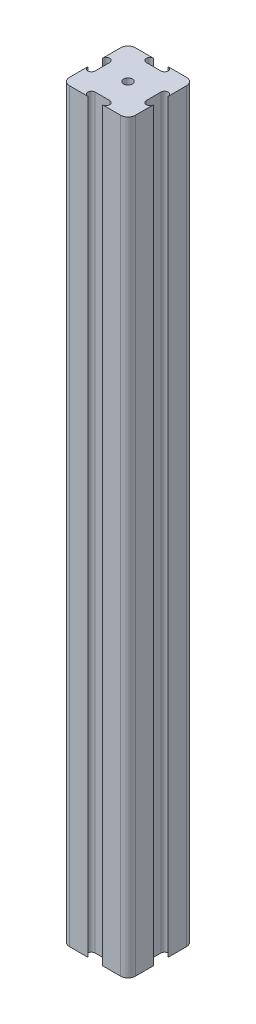
ISO-10303-21;
HEADER;
FILE_DESCRIPTION(('STEP AP214'),'2;1');
FILE_NAME('part.step','',(''),(''),'','','');
FILE_SCHEMA(('AUTOMOTIVE_DESIGN { 1 0 10303 214 1 1 1 1 }'));
ENDSEC;
DATA;
#1=APPLICATION_CONTEXT('core data for automotive mechanical design processes');
#2=APPLICATION_PROTOCOL_DEFINITION('international standard','automotive_design',2000,#1);
#3=PRODUCT_CONTEXT('',#1,'mechanical');
#4=PRODUCT('Part','Part','',(#3));
#5=PRODUCT_RELATED_PRODUCT_CATEGORY('part','',(#4));
#6=PRODUCT_DEFINITION_FORMATION('','',#4);
#7=PRODUCT_DEFINITION_CONTEXT('part definition',#1,'design');
#8=PRODUCT_DEFINITION('design','',#6,#7);
#9=PRODUCT_DEFINITION_SHAPE('','',#8);
#10=(LENGTH_UNIT() NAMED_UNIT(*) SI_UNIT(.MILLI.,.METRE.));
#11=(NAMED_UNIT(*) PLANE_ANGLE_UNIT() SI_UNIT($,.RADIAN.));
#12=(NAMED_UNIT(*) SI_UNIT($,.STERADIAN.) SOLID_ANGLE_UNIT());
#13=UNCERTAINTY_MEASURE_WITH_UNIT(LENGTH_MEASURE(1.E-05),#10,'distance_accuracy_value','');
#14=(GEOMETRIC_REPRESENTATION_CONTEXT(3) GLOBAL_UNCERTAINTY_ASSIGNED_CONTEXT((#13)) GLOBAL_UNIT_ASSIGNED_CONTEXT((#10,
#11,#12)) REPRESENTATION_CONTEXT('',''));
#15=CARTESIAN_POINT('',(0.,0.,0.));
#16=DIRECTION('',(0.,0.,1.));
#17=DIRECTION('',(1.,0.,0.));
#18=AXIS2_PLACEMENT_3D('',#15,#16,#17);
#19=CARTESIAN_POINT('',(-20.,510.,5.));
#20=DIRECTION('',(0.,-1.,0.));
#21=DIRECTION('',(0.,0.,-1.));
#22=AXIS2_PLACEMENT_3D('',#19,#20,#21);
#23=CYLINDRICAL_SURFACE('',#22,2.5);
#24=CARTESIAN_POINT('',(-20.,0.,5.));
#25=DIRECTION('',(0.,-1.,0.));
#26=DIRECTION('',(0.,0.,-1.));
#27=AXIS2_PLACEMENT_3D('',#24,#25,#26);
#28=CIRCLE('',#27,2.5);
#29=CARTESIAN_POINT('',(-17.5,0.,5.));
#30=VERTEX_POINT('',#29);
#31=CARTESIAN_POINT('',(-22.5,0.,5.));
#32=VERTEX_POINT('',#31);
#33=EDGE_CURVE('E225',#30,#32,#28,.T.);
#34=ORIENTED_EDGE('',*,*,#33,.T.);
#35=DIRECTION('',(0.,-1.,0.));
#36=VECTOR('',#35,1.);
#37=CARTESIAN_POINT('',(-22.5,510.,5.));
#38=LINE('',#37,#36);
#39=CARTESIAN_POINT('',(-22.5,510.,5.));
#40=VERTEX_POINT('',#39);
#41=EDGE_CURVE('E11',#40,#32,#38,.T.);
#42=ORIENTED_EDGE('',*,*,#41,.F.);
#43=CARTESIAN_POINT('',(-20.,510.,5.));
#44=DIRECTION('',(0.,-1.,0.));
#45=DIRECTION('',(0.,0.,-1.));
#46=AXIS2_PLACEMENT_3D('',#43,#44,#45);
#47=CIRCLE('',#46,2.5);
#48=CARTESIAN_POINT('',(-17.5,510.,5.));
#49=VERTEX_POINT('',#48);
#50=EDGE_CURVE('E290',#49,#40,#47,.T.);
#51=ORIENTED_EDGE('',*,*,#50,.F.);
#52=DIRECTION('',(0.,-1.,0.));
#53=VECTOR('',#52,1.);
#54=CARTESIAN_POINT('',(-17.5,510.,5.));
#55=LINE('',#54,#53);
#56=EDGE_CURVE('E221',#49,#30,#55,.T.);
#57=ORIENTED_EDGE('',*,*,#56,.T.);
#58=EDGE_LOOP('',(#34,#42,#51,#57));
#59=FACE_BOUND('',#58,.T.);
#60=ADVANCED_FACE('F33',(#59),#23,.F.);
#61=CARTESIAN_POINT('',(-22.5,510.,5.));
#62=DIRECTION('',(1.,0.,0.));
#63=DIRECTION('',(0.,0.,-1.));
#64=AXIS2_PLACEMENT_3D('',#61,#62,#63);
#65=PLANE('',#64);
#66=DIRECTION('',(0.,0.,1.));
#67=VECTOR('',#66,1.);
#68=CARTESIAN_POINT('',(-22.5,0.,5.));
#69=LINE('',#68,#67);
#70=CARTESIAN_POINT('',(-22.5,0.,17.4999999999999));
#71=VERTEX_POINT('',#70);
#72=EDGE_CURVE('E228',#32,#71,#69,.T.);
#73=ORIENTED_EDGE('',*,*,#72,.T.);
#74=DIRECTION('',(0.,-1.,0.));
#75=VECTOR('',#74,1.);
#76=CARTESIAN_POINT('',(-22.5,510.,17.4999999999999));
#77=LINE('',#76,#75);
#78=CARTESIAN_POINT('',(-22.5,510.,17.4999999999999));
#79=VERTEX_POINT('',#78);
#80=EDGE_CURVE('E41',#79,#71,#77,.T.);
#81=ORIENTED_EDGE('',*,*,#80,.F.);
#82=DIRECTION('',(0.,0.,1.));
#83=VECTOR('',#82,1.);
#84=CARTESIAN_POINT('',(-22.5,510.,5.));
#85=LINE('',#84,#83);
#86=EDGE_CURVE('E136',#40,#79,#85,.T.);
#87=ORIENTED_EDGE('',*,*,#86,.F.);
#88=ORIENTED_EDGE('',*,*,#41,.T.);
#89=EDGE_LOOP('',(#73,#81,#87,#88));
#90=FACE_BOUND('',#89,.T.);
#91=ADVANCED_FACE('F417',(#90),#65,.F.);
#92=CARTESIAN_POINT('',(-17.5,510.,17.5));
#93=DIRECTION('',(0.,-1.,0.));
#94=DIRECTION('',(0.,0.,-1.));
#95=AXIS2_PLACEMENT_3D('',#92,#93,#94);
#96=CYLINDRICAL_SURFACE('',#95,5.);
#97=CARTESIAN_POINT('',(-17.5,0.,17.5));
#98=DIRECTION('',(0.,1.,0.));
#99=DIRECTION('',(0.,0.,1.));
#100=AXIS2_PLACEMENT_3D('',#97,#98,#99);
#101=CIRCLE('',#100,5.);
#102=CARTESIAN_POINT('',(-17.5,0.,22.5));
#103=VERTEX_POINT('',#102);
#104=EDGE_CURVE('E231',#71,#103,#101,.T.);
#105=ORIENTED_EDGE('',*,*,#104,.T.);
#106=DIRECTION('',(0.,-1.,0.));
#107=VECTOR('',#106,1.);
#108=CARTESIAN_POINT('',(-17.5,510.,22.5));
#109=LINE('',#108,#107);
#110=CARTESIAN_POINT('',(-17.5,510.,22.5));
#111=VERTEX_POINT('',#110);
#112=EDGE_CURVE('E329',#111,#103,#109,.T.);
#113=ORIENTED_EDGE('',*,*,#112,.F.);
#114=CARTESIAN_POINT('',(-17.5,510.,17.5));
#115=DIRECTION('',(0.,1.,0.));
#116=DIRECTION('',(0.,0.,1.));
#117=AXIS2_PLACEMENT_3D('',#114,#115,#116);
#118=CIRCLE('',#117,5.);
#119=EDGE_CURVE('E336',#79,#111,#118,.T.);
#120=ORIENTED_EDGE('',*,*,#119,.F.);
#121=ORIENTED_EDGE('',*,*,#80,.T.);
#122=EDGE_LOOP('',(#105,#113,#120,#121));
#123=FACE_BOUND('',#122,.T.);
#124=ADVANCED_FACE('F334',(#123),#96,.T.);
#125=CARTESIAN_POINT('',(-4.99999999999998,510.,22.5));
#126=DIRECTION('',(0.,0.,1.));
#127=DIRECTION('',(1.,0.,0.));
#128=AXIS2_PLACEMENT_3D('',#125,#126,#127);
#129=PLANE('',#128);
#130=DIRECTION('',(-1.,0.,0.));
#131=VECTOR('',#130,1.);
#132=CARTESIAN_POINT('',(-4.99999999999998,0.,22.5));
#133=LINE('',#132,#131);
#134=CARTESIAN_POINT('',(-4.99999999999998,0.,22.5));
#135=VERTEX_POINT('',#134);
#136=EDGE_CURVE('E234',#135,#103,#133,.T.);
#137=ORIENTED_EDGE('',*,*,#136,.F.);
#138=DIRECTION('',(0.,-1.,0.));
#139=VECTOR('',#138,1.);
#140=CARTESIAN_POINT('',(-4.99999999999998,510.,22.5));
#141=LINE('',#140,#139);
#142=CARTESIAN_POINT('',(-4.99999999999998,510.,22.5));
#143=VERTEX_POINT('',#142);
#144=EDGE_CURVE('E327',#143,#135,#141,.T.);
#145=ORIENTED_EDGE('',*,*,#144,.F.);
#146=DIRECTION('',(-1.,0.,0.));
#147=VECTOR('',#146,1.);
#148=CARTESIAN_POINT('',(-4.99999999999998,510.,22.5));
#149=LINE('',#148,#147);
#150=EDGE_CURVE('E347',#143,#111,#149,.T.);
#151=ORIENTED_EDGE('',*,*,#150,.T.);
#152=ORIENTED_EDGE('',*,*,#112,.T.);
#153=EDGE_LOOP('',(#137,#145,#151,#152));
#154=FACE_BOUND('',#153,.T.);
#155=ADVANCED_FACE('F344',(#154),#129,.T.);
#156=CARTESIAN_POINT('',(-5.,510.,20.));
#157=DIRECTION('',(0.,-1.,0.));
#158=DIRECTION('',(0.,0.,-1.));
#159=AXIS2_PLACEMENT_3D('',#156,#157,#158);
#160=CYLINDRICAL_SURFACE('',#159,2.5);
#161=CARTESIAN_POINT('',(-5.,0.,20.));
#162=DIRECTION('',(0.,1.,0.));
#163=DIRECTION('',(0.,0.,1.));
#164=AXIS2_PLACEMENT_3D('',#161,#162,#163);
#165=CIRCLE('',#164,2.5);
#166=CARTESIAN_POINT('',(-4.99999999999998,0.,17.5));
#167=VERTEX_POINT('',#166);
#168=EDGE_CURVE('E237',#167,#135,#165,.T.);
#169=ORIENTED_EDGE('',*,*,#168,.F.);
#170=DIRECTION('',(0.,-1.,0.));
#171=VECTOR('',#170,1.);
#172=CARTESIAN_POINT('',(-4.99999999999998,510.,17.5));
#173=LINE('',#172,#171);
#174=CARTESIAN_POINT('',(-4.99999999999998,510.,17.5));
#175=VERTEX_POINT('',#174);
#176=EDGE_CURVE('E325',#175,#167,#173,.T.);
#177=ORIENTED_EDGE('',*,*,#176,.F.);
#178=CARTESIAN_POINT('',(-5.,510.,20.));
#179=DIRECTION('',(0.,1.,0.));
#180=DIRECTION('',(0.,0.,1.));
#181=AXIS2_PLACEMENT_3D('',#178,#179,#180);
#182=CIRCLE('',#181,2.5);
#183=EDGE_CURVE('E350',#175,#143,#182,.T.);
#184=ORIENTED_EDGE('',*,*,#183,.T.);
#185=ORIENTED_EDGE('',*,*,#144,.T.);
#186=EDGE_LOOP('',(#169,#177,#184,#185));
#187=FACE_BOUND('',#186,.T.);
#188=ADVANCED_FACE('F624',(#187),#160,.F.);
#189=CARTESIAN_POINT('',(-4.99999999999998,510.,17.5));
#190=DIRECTION('',(0.,0.,-1.));
#191=DIRECTION('',(-1.,0.,0.));
#192=AXIS2_PLACEMENT_3D('',#189,#190,#191);
#193=PLANE('',#192);
#194=DIRECTION('',(1.,0.,0.));
#195=VECTOR('',#194,1.);
#196=CARTESIAN_POINT('',(-4.99999999999998,0.,17.5));
#197=LINE('',#196,#195);
#198=CARTESIAN_POINT('',(5.00000000000002,0.,17.5));
#199=VERTEX_POINT('',#198);
#200=EDGE_CURVE('E240',#167,#199,#197,.T.);
#201=ORIENTED_EDGE('',*,*,#200,.T.);
#202=DIRECTION('',(0.,-1.,0.));
#203=VECTOR('',#202,1.);
#204=CARTESIAN_POINT('',(5.00000000000002,510.,17.5));
#205=LINE('',#204,#203);
#206=CARTESIAN_POINT('',(5.00000000000002,510.,17.5));
#207=VERTEX_POINT('',#206);
#208=EDGE_CURVE('E323',#207,#199,#205,.T.);
#209=ORIENTED_EDGE('',*,*,#208,.F.);
#210=DIRECTION('',(1.,0.,0.));
#211=VECTOR('',#210,1.);
#212=CARTESIAN_POINT('',(-4.99999999999998,510.,17.5));
#213=LINE('',#212,#211);
#214=EDGE_CURVE('E352',#175,#207,#213,.T.);
#215=ORIENTED_EDGE('',*,*,#214,.F.);
#216=ORIENTED_EDGE('',*,*,#176,.T.);
#217=EDGE_LOOP('',(#201,#209,#215,#216));
#218=FACE_BOUND('',#217,.T.);
#219=ADVANCED_FACE('F614',(#218),#193,.F.);
#220=CARTESIAN_POINT('',(4.99999999999996,510.,20.));
#221=DIRECTION('',(0.,-1.,0.));
#222=DIRECTION('',(0.,0.,-1.));
#223=AXIS2_PLACEMENT_3D('',#220,#221,#222);
#224=CYLINDRICAL_SURFACE('',#223,2.50000000000001);
#225=CARTESIAN_POINT('',(4.99999999999996,0.,20.));
#226=DIRECTION('',(0.,1.,0.));
#227=DIRECTION('',(0.,0.,1.));
#228=AXIS2_PLACEMENT_3D('',#225,#226,#227);
#229=CIRCLE('',#228,2.50000000000001);
#230=CARTESIAN_POINT('',(4.99999999999996,0.,22.5));
#231=VERTEX_POINT('',#230);
#232=EDGE_CURVE('E243',#231,#199,#229,.T.);
#233=ORIENTED_EDGE('',*,*,#232,.F.);
#234=DIRECTION('',(0.,-1.,0.));
#235=VECTOR('',#234,1.);
#236=CARTESIAN_POINT('',(4.99999999999996,510.,22.5));
#237=LINE('',#236,#235);
#238=CARTESIAN_POINT('',(4.99999999999996,510.,22.5));
#239=VERTEX_POINT('',#238);
#240=EDGE_CURVE('E321',#239,#231,#237,.T.);
#241=ORIENTED_EDGE('',*,*,#240,.F.);
#242=CARTESIAN_POINT('',(4.99999999999996,510.,20.));
#243=DIRECTION('',(0.,1.,0.));
#244=DIRECTION('',(0.,0.,1.));
#245=AXIS2_PLACEMENT_3D('',#242,#243,#244);
#246=CIRCLE('',#245,2.50000000000001);
#247=EDGE_CURVE('E358',#239,#207,#246,.T.);
#248=ORIENTED_EDGE('',*,*,#247,.T.);
#249=ORIENTED_EDGE('',*,*,#208,.T.);
#250=EDGE_LOOP('',(#233,#241,#248,#249));
#251=FACE_BOUND('',#250,.T.);
#252=ADVANCED_FACE('F604',(#251),#224,.F.);
#253=CARTESIAN_POINT('',(4.99999999999996,510.,22.5));
#254=DIRECTION('',(0.,0.,-1.));
#255=DIRECTION('',(-1.,0.,0.));
#256=AXIS2_PLACEMENT_3D('',#253,#254,#255);
#257=PLANE('',#256);
#258=DIRECTION('',(1.,0.,0.));
#259=VECTOR('',#258,1.);
#260=CARTESIAN_POINT('',(4.99999999999996,0.,22.5));
#261=LINE('',#260,#259);
#262=CARTESIAN_POINT('',(17.5,0.,22.5));
#263=VERTEX_POINT('',#262);
#264=EDGE_CURVE('E246',#231,#263,#261,.T.);
#265=ORIENTED_EDGE('',*,*,#264,.T.);
#266=DIRECTION('',(0.,-1.,0.));
#267=VECTOR('',#266,1.);
#268=CARTESIAN_POINT('',(17.5,510.,22.5));
#269=LINE('',#268,#267);
#270=CARTESIAN_POINT('',(17.5,510.,22.5));
#271=VERTEX_POINT('',#270);
#272=EDGE_CURVE('E318',#271,#263,#269,.T.);
#273=ORIENTED_EDGE('',*,*,#272,.F.);
#274=DIRECTION('',(1.,0.,0.));
#275=VECTOR('',#274,1.);
#276=CARTESIAN_POINT('',(4.99999999999996,510.,22.5));
#277=LINE('',#276,#275);
#278=EDGE_CURVE('E361',#239,#271,#277,.T.);
#279=ORIENTED_EDGE('',*,*,#278,.F.);
#280=ORIENTED_EDGE('',*,*,#240,.T.);
#281=EDGE_LOOP('',(#265,#273,#279,#280));
#282=FACE_BOUND('',#281,.T.);
#283=ADVANCED_FACE('F594',(#282),#257,.F.);
#284=CARTESIAN_POINT('',(17.5000000000006,510.,17.5));
#285=DIRECTION('',(0.,-1.,0.));
#286=DIRECTION('',(0.,0.,-1.));
#287=AXIS2_PLACEMENT_3D('',#284,#285,#286);
#288=CYLINDRICAL_SURFACE('',#287,5.);
#289=CARTESIAN_POINT('',(17.5000000000006,0.,17.5));
#290=DIRECTION('',(0.,1.,0.));
#291=DIRECTION('',(0.,0.,1.));
#292=AXIS2_PLACEMENT_3D('',#289,#290,#291);
#293=CIRCLE('',#292,5.);
#294=CARTESIAN_POINT('',(22.5,0.,17.5000025246919));
#295=VERTEX_POINT('',#294);
#296=EDGE_CURVE('E248',#263,#295,#293,.T.);
#297=ORIENTED_EDGE('',*,*,#296,.T.);
#298=DIRECTION('',(0.,-1.,0.));
#299=VECTOR('',#298,1.);
#300=CARTESIAN_POINT('',(22.5,510.,17.5000025246919));
#301=LINE('',#300,#299);
#302=CARTESIAN_POINT('',(22.5,510.,17.5000025246919));
#303=VERTEX_POINT('',#302);
#304=EDGE_CURVE('E316',#303,#295,#301,.T.);
#305=ORIENTED_EDGE('',*,*,#304,.F.);
#306=CARTESIAN_POINT('',(17.5000000000006,510.,17.5));
#307=DIRECTION('',(0.,1.,0.));
#308=DIRECTION('',(0.,0.,1.));
#309=AXIS2_PLACEMENT_3D('',#306,#307,#308);
#310=CIRCLE('',#309,5.);
#311=EDGE_CURVE('E363',#271,#303,#310,.T.);
#312=ORIENTED_EDGE('',*,*,#311,.F.);
#313=ORIENTED_EDGE('',*,*,#272,.T.);
#314=EDGE_LOOP('',(#297,#305,#312,#313));
#315=FACE_BOUND('',#314,.T.);
#316=ADVANCED_FACE('F584',(#315),#288,.T.);
#317=CARTESIAN_POINT('',(22.5,510.,5.00000252469196));
#318=DIRECTION('',(1.,0.,0.));
#319=DIRECTION('',(0.,0.,-1.));
#320=AXIS2_PLACEMENT_3D('',#317,#318,#319);
#321=PLANE('',#320);
#322=DIRECTION('',(0.,0.,1.));
#323=VECTOR('',#322,1.);
#324=CARTESIAN_POINT('',(22.5,0.,5.00000252469196));
#325=LINE('',#324,#323);
#326=CARTESIAN_POINT('',(22.5,0.,5.00000252469196));
#327=VERTEX_POINT('',#326);
#328=EDGE_CURVE('E251',#327,#295,#325,.T.);
#329=ORIENTED_EDGE('',*,*,#328,.F.);
#330=DIRECTION('',(0.,-1.,0.));
#331=VECTOR('',#330,1.);
#332=CARTESIAN_POINT('',(22.5,510.,5.00000252469196));
#333=LINE('',#332,#331);
#334=CARTESIAN_POINT('',(22.5,510.,5.00000252469196));
#335=VERTEX_POINT('',#334);
#336=EDGE_CURVE('E314',#335,#327,#333,.T.);
#337=ORIENTED_EDGE('',*,*,#336,.F.);
#338=DIRECTION('',(0.,0.,1.));
#339=VECTOR('',#338,1.);
#340=CARTESIAN_POINT('',(22.5,510.,5.00000252469196));
#341=LINE('',#340,#339);
#342=EDGE_CURVE('E365',#335,#303,#341,.T.);
#343=ORIENTED_EDGE('',*,*,#342,.T.);
#344=ORIENTED_EDGE('',*,*,#304,.T.);
#345=EDGE_LOOP('',(#329,#337,#343,#344));
#346=FACE_BOUND('',#345,.T.);
#347=ADVANCED_FACE('F574',(#346),#321,.T.);
#348=CARTESIAN_POINT('',(20.,510.,5.00000252469196));
#349=DIRECTION('',(0.,-1.,0.));
#350=DIRECTION('',(0.,0.,-1.));
#351=AXIS2_PLACEMENT_3D('',#348,#349,#350);
#352=CYLINDRICAL_SURFACE('',#351,2.5);
#353=CARTESIAN_POINT('',(20.,0.,5.00000252469196));
#354=DIRECTION('',(0.,-1.,0.));
#355=DIRECTION('',(0.,0.,-1.));
#356=AXIS2_PLACEMENT_3D('',#353,#354,#355);
#357=CIRCLE('',#356,2.5);
#358=CARTESIAN_POINT('',(17.5,0.,5.00000252469196));
#359=VERTEX_POINT('',#358);
#360=EDGE_CURVE('E254',#327,#359,#357,.T.);
#361=ORIENTED_EDGE('',*,*,#360,.T.);
#362=DIRECTION('',(0.,-1.,0.));
#363=VECTOR('',#362,1.);
#364=CARTESIAN_POINT('',(17.5,510.,5.00000252469196));
#365=LINE('',#364,#363);
#366=CARTESIAN_POINT('',(17.5,510.,5.00000252469196));
#367=VERTEX_POINT('',#366);
#368=EDGE_CURVE('E312',#367,#359,#365,.T.);
#369=ORIENTED_EDGE('',*,*,#368,.F.);
#370=CARTESIAN_POINT('',(20.,510.,5.00000252469196));
#371=DIRECTION('',(0.,-1.,0.));
#372=DIRECTION('',(0.,0.,-1.));
#373=AXIS2_PLACEMENT_3D('',#370,#371,#372);
#374=CIRCLE('',#373,2.5);
#375=EDGE_CURVE('E368',#335,#367,#374,.T.);
#376=ORIENTED_EDGE('',*,*,#375,.F.);
#377=ORIENTED_EDGE('',*,*,#336,.T.);
#378=EDGE_LOOP('',(#361,#369,#376,#377));
#379=FACE_BOUND('',#378,.T.);
#380=ADVANCED_FACE('F564',(#379),#352,.F.);
#381=CARTESIAN_POINT('',(17.5,510.,-4.99999747530804));
#382=DIRECTION('',(1.,0.,0.));
#383=DIRECTION('',(0.,0.,-1.));
#384=AXIS2_PLACEMENT_3D('',#381,#382,#383);
#385=PLANE('',#384);
#386=DIRECTION('',(0.,0.,1.));
#387=VECTOR('',#386,1.);
#388=CARTESIAN_POINT('',(17.5,0.,-4.99999747530804));
#389=LINE('',#388,#387);
#390=CARTESIAN_POINT('',(17.5,0.,-4.99999747530804));
#391=VERTEX_POINT('',#390);
#392=EDGE_CURVE('E257',#391,#359,#389,.T.);
#393=ORIENTED_EDGE('',*,*,#392,.F.);
#394=DIRECTION('',(0.,-1.,0.));
#395=VECTOR('',#394,1.);
#396=CARTESIAN_POINT('',(17.5,510.,-4.99999747530804));
#397=LINE('',#396,#395);
#398=CARTESIAN_POINT('',(17.5,510.,-4.99999747530804));
#399=VERTEX_POINT('',#398);
#400=EDGE_CURVE('E310',#399,#391,#397,.T.);
#401=ORIENTED_EDGE('',*,*,#400,.F.);
#402=DIRECTION('',(0.,0.,1.));
#403=VECTOR('',#402,1.);
#404=CARTESIAN_POINT('',(17.5,510.,-4.99999747530804));
#405=LINE('',#404,#403);
#406=EDGE_CURVE('E370',#399,#367,#405,.T.);
#407=ORIENTED_EDGE('',*,*,#406,.T.);
#408=ORIENTED_EDGE('',*,*,#368,.T.);
#409=EDGE_LOOP('',(#393,#401,#407,#408));
#410=FACE_BOUND('',#409,.T.);
#411=ADVANCED_FACE('F554',(#410),#385,.T.);
#412=CARTESIAN_POINT('',(20.,510.,-4.99999747530804));
#413=DIRECTION('',(0.,-1.,0.));
#414=DIRECTION('',(0.,0.,-1.));
#415=AXIS2_PLACEMENT_3D('',#412,#413,#414);
#416=CYLINDRICAL_SURFACE('',#415,2.5);
#417=CARTESIAN_POINT('',(20.,0.,-4.99999747530804));
#418=DIRECTION('',(0.,1.,0.));
#419=DIRECTION('',(0.,0.,1.));
#420=AXIS2_PLACEMENT_3D('',#417,#418,#419);
#421=CIRCLE('',#420,2.5);
#422=CARTESIAN_POINT('',(22.5,0.,-4.99999747530804));
#423=VERTEX_POINT('',#422);
#424=EDGE_CURVE('E260',#423,#391,#421,.T.);
#425=ORIENTED_EDGE('',*,*,#424,.F.);
#426=DIRECTION('',(0.,-1.,0.));
#427=VECTOR('',#426,1.);
#428=CARTESIAN_POINT('',(22.5,510.,-4.99999747530804));
#429=LINE('',#428,#427);
#430=CARTESIAN_POINT('',(22.5,510.,-4.99999747530804));
#431=VERTEX_POINT('',#430);
#432=EDGE_CURVE('E308',#431,#423,#429,.T.);
#433=ORIENTED_EDGE('',*,*,#432,.F.);
#434=CARTESIAN_POINT('',(20.,510.,-4.99999747530804));
#435=DIRECTION('',(0.,1.,0.));
#436=DIRECTION('',(0.,0.,1.));
#437=AXIS2_PLACEMENT_3D('',#434,#435,#436);
#438=CIRCLE('',#437,2.5);
#439=EDGE_CURVE('E373',#431,#399,#438,.T.);
#440=ORIENTED_EDGE('',*,*,#439,.T.);
#441=ORIENTED_EDGE('',*,*,#400,.T.);
#442=EDGE_LOOP('',(#425,#433,#440,#441));
#443=FACE_BOUND('',#442,.T.);
#444=ADVANCED_FACE('F544',(#443),#416,.F.);
#445=CARTESIAN_POINT('',(22.5,510.,-4.99999747530804));
#446=DIRECTION('',(-1.,0.,0.));
#447=DIRECTION('',(0.,0.,1.));
#448=AXIS2_PLACEMENT_3D('',#445,#446,#447);
#449=PLANE('',#448);
#450=DIRECTION('',(0.,0.,-1.));
#451=VECTOR('',#450,1.);
#452=CARTESIAN_POINT('',(22.5,0.,-4.99999747530804));
#453=LINE('',#452,#451);
#454=CARTESIAN_POINT('',(22.5,0.,-17.499997475308));
#455=VERTEX_POINT('',#454);
#456=EDGE_CURVE('E263',#423,#455,#453,.T.);
#457=ORIENTED_EDGE('',*,*,#456,.T.);
#458=DIRECTION('',(0.,-1.,0.));
#459=VECTOR('',#458,1.);
#460=CARTESIAN_POINT('',(22.5,510.,-17.499997475308));
#461=LINE('',#460,#459);
#462=CARTESIAN_POINT('',(22.5,510.,-17.499997475308));
#463=VERTEX_POINT('',#462);
#464=EDGE_CURVE('E306',#463,#455,#461,.T.);
#465=ORIENTED_EDGE('',*,*,#464,.F.);
#466=DIRECTION('',(0.,0.,-1.));
#467=VECTOR('',#466,1.);
#468=CARTESIAN_POINT('',(22.5,510.,-4.99999747530804));
#469=LINE('',#468,#467);
#470=EDGE_CURVE('E376',#431,#463,#469,.T.);
#471=ORIENTED_EDGE('',*,*,#470,.F.);
#472=ORIENTED_EDGE('',*,*,#432,.T.);
#473=EDGE_LOOP('',(#457,#465,#471,#472));
#474=FACE_BOUND('',#473,.T.);
#475=ADVANCED_FACE('F534',(#474),#449,.F.);
#476=CARTESIAN_POINT('',(17.5000000000006,510.,-17.5));
#477=DIRECTION('',(0.,-1.,0.));
#478=DIRECTION('',(0.,0.,-1.));
#479=AXIS2_PLACEMENT_3D('',#476,#477,#478);
#480=CYLINDRICAL_SURFACE('',#479,5.00000000000001);
#481=CARTESIAN_POINT('',(17.5000000000006,0.,-17.5));
#482=DIRECTION('',(0.,-1.,0.));
#483=DIRECTION('',(0.,0.,-1.));
#484=AXIS2_PLACEMENT_3D('',#481,#482,#483);
#485=CIRCLE('',#484,5.00000000000001);
#486=CARTESIAN_POINT('',(17.5,0.,-22.5));
#487=VERTEX_POINT('',#486);
#488=EDGE_CURVE('E266',#487,#455,#485,.T.);
#489=ORIENTED_EDGE('',*,*,#488,.F.);
#490=DIRECTION('',(0.,-1.,0.));
#491=VECTOR('',#490,1.);
#492=CARTESIAN_POINT('',(17.5,510.,-22.5));
#493=LINE('',#492,#491);
#494=CARTESIAN_POINT('',(17.5,510.,-22.5));
#495=VERTEX_POINT('',#494);
#496=EDGE_CURVE('E304',#495,#487,#493,.T.);
#497=ORIENTED_EDGE('',*,*,#496,.F.);
#498=CARTESIAN_POINT('',(17.5000000000006,510.,-17.5));
#499=DIRECTION('',(0.,-1.,0.));
#500=DIRECTION('',(0.,0.,-1.));
#501=AXIS2_PLACEMENT_3D('',#498,#499,#500);
#502=CIRCLE('',#501,5.00000000000001);
#503=EDGE_CURVE('E378',#495,#463,#502,.T.);
#504=ORIENTED_EDGE('',*,*,#503,.T.);
#505=ORIENTED_EDGE('',*,*,#464,.T.);
#506=EDGE_LOOP('',(#489,#497,#504,#505));
#507=FACE_BOUND('',#506,.T.);
#508=ADVANCED_FACE('F524',(#507),#480,.T.);
#509=CARTESIAN_POINT('',(5.00000000000003,510.,-22.5));
#510=DIRECTION('',(0.,0.,-1.));
#511=DIRECTION('',(-1.,0.,0.));
#512=AXIS2_PLACEMENT_3D('',#509,#510,#511);
#513=PLANE('',#512);
#514=DIRECTION('',(1.,0.,0.));
#515=VECTOR('',#514,1.);
#516=CARTESIAN_POINT('',(5.00000000000003,0.,-22.5));
#517=LINE('',#516,#515);
#518=CARTESIAN_POINT('',(5.00000000000003,0.,-22.5));
#519=VERTEX_POINT('',#518);
#520=EDGE_CURVE('E269',#519,#487,#517,.T.);
#521=ORIENTED_EDGE('',*,*,#520,.F.);
#522=DIRECTION('',(0.,-1.,0.));
#523=VECTOR('',#522,1.);
#524=CARTESIAN_POINT('',(5.00000000000003,510.,-22.5));
#525=LINE('',#524,#523);
#526=CARTESIAN_POINT('',(5.00000000000003,510.,-22.5));
#527=VERTEX_POINT('',#526);
#528=EDGE_CURVE('E302',#527,#519,#525,.T.);
#529=ORIENTED_EDGE('',*,*,#528,.F.);
#530=DIRECTION('',(1.,0.,0.));
#531=VECTOR('',#530,1.);
#532=CARTESIAN_POINT('',(5.00000000000003,510.,-22.5));
#533=LINE('',#532,#531);
#534=EDGE_CURVE('E381',#527,#495,#533,.T.);
#535=ORIENTED_EDGE('',*,*,#534,.T.);
#536=ORIENTED_EDGE('',*,*,#496,.T.);
#537=EDGE_LOOP('',(#521,#529,#535,#536));
#538=FACE_BOUND('',#537,.T.);
#539=ADVANCED_FACE('F514',(#538),#513,.T.);
#540=CARTESIAN_POINT('',(5.00000000000003,510.,-20.));
#541=DIRECTION('',(0.,-1.,0.));
#542=DIRECTION('',(0.,0.,-1.));
#543=AXIS2_PLACEMENT_3D('',#540,#541,#542);
#544=CYLINDRICAL_SURFACE('',#543,2.50000000000001);
#545=CARTESIAN_POINT('',(5.00000000000003,0.,-20.));
#546=DIRECTION('',(0.,1.,0.));
#547=DIRECTION('',(0.,0.,1.));
#548=AXIS2_PLACEMENT_3D('',#545,#546,#547);
#549=CIRCLE('',#548,2.50000000000001);
#550=CARTESIAN_POINT('',(5.00000000000001,0.,-17.5));
#551=VERTEX_POINT('',#550);
#552=EDGE_CURVE('E272',#551,#519,#549,.T.);
#553=ORIENTED_EDGE('',*,*,#552,.F.);
#554=DIRECTION('',(0.,-1.,0.));
#555=VECTOR('',#554,1.);
#556=CARTESIAN_POINT('',(5.00000000000001,510.,-17.5));
#557=LINE('',#556,#555);
#558=CARTESIAN_POINT('',(5.00000000000001,510.,-17.5));
#559=VERTEX_POINT('',#558);
#560=EDGE_CURVE('E300',#559,#551,#557,.T.);
#561=ORIENTED_EDGE('',*,*,#560,.F.);
#562=CARTESIAN_POINT('',(5.00000000000003,510.,-20.));
#563=DIRECTION('',(0.,1.,0.));
#564=DIRECTION('',(0.,0.,1.));
#565=AXIS2_PLACEMENT_3D('',#562,#563,#564);
#566=CIRCLE('',#565,2.50000000000001);
#567=EDGE_CURVE('E384',#559,#527,#566,.T.);
#568=ORIENTED_EDGE('',*,*,#567,.T.);
#569=ORIENTED_EDGE('',*,*,#528,.T.);
#570=EDGE_LOOP('',(#553,#561,#568,#569));
#571=FACE_BOUND('',#570,.T.);
#572=ADVANCED_FACE('F504',(#571),#544,.F.);
#573=CARTESIAN_POINT('',(-5.,510.,-17.5));
#574=DIRECTION('',(0.,0.,-1.));
#575=DIRECTION('',(-1.,0.,0.));
#576=AXIS2_PLACEMENT_3D('',#573,#574,#575);
#577=PLANE('',#576);
#578=DIRECTION('',(1.,0.,0.));
#579=VECTOR('',#578,1.);
#580=CARTESIAN_POINT('',(-5.,0.,-17.5));
#581=LINE('',#580,#579);
#582=CARTESIAN_POINT('',(-5.,0.,-17.5));
#583=VERTEX_POINT('',#582);
#584=EDGE_CURVE('E275',#583,#551,#581,.T.);
#585=ORIENTED_EDGE('',*,*,#584,.F.);
#586=DIRECTION('',(0.,-1.,0.));
#587=VECTOR('',#586,1.);
#588=CARTESIAN_POINT('',(-5.,510.,-17.5));
#589=LINE('',#588,#587);
#590=CARTESIAN_POINT('',(-5.,510.,-17.5));
#591=VERTEX_POINT('',#590);
#592=EDGE_CURVE('E298',#591,#583,#589,.T.);
#593=ORIENTED_EDGE('',*,*,#592,.F.);
#594=DIRECTION('',(1.,0.,0.));
#595=VECTOR('',#594,1.);
#596=CARTESIAN_POINT('',(-5.,510.,-17.5));
#597=LINE('',#596,#595);
#598=EDGE_CURVE('E387',#591,#559,#597,.T.);
#599=ORIENTED_EDGE('',*,*,#598,.T.);
#600=ORIENTED_EDGE('',*,*,#560,.T.);
#601=EDGE_LOOP('',(#585,#593,#599,#600));
#602=FACE_BOUND('',#601,.T.);
#603=ADVANCED_FACE('F495',(#602),#577,.T.);
#604=CARTESIAN_POINT('',(-5.00000000000003,510.,-20.));
#605=DIRECTION('',(0.,-1.,0.));
#606=DIRECTION('',(0.,0.,-1.));
#607=AXIS2_PLACEMENT_3D('',#604,#605,#606);
#608=CYLINDRICAL_SURFACE('',#607,2.5);
#609=CARTESIAN_POINT('',(-5.00000000000003,0.,-20.));
#610=DIRECTION('',(0.,1.,0.));
#611=DIRECTION('',(0.,0.,1.));
#612=AXIS2_PLACEMENT_3D('',#609,#610,#611);
#613=CIRCLE('',#612,2.5);
#614=CARTESIAN_POINT('',(-5.00000000000003,0.,-22.5));
#615=VERTEX_POINT('',#614);
#616=EDGE_CURVE('E278',#615,#583,#613,.T.);
#617=ORIENTED_EDGE('',*,*,#616,.F.);
#618=DIRECTION('',(0.,-1.,0.));
#619=VECTOR('',#618,1.);
#620=CARTESIAN_POINT('',(-5.00000000000003,510.,-22.5));
#621=LINE('',#620,#619);
#622=CARTESIAN_POINT('',(-5.00000000000003,510.,-22.5));
#623=VERTEX_POINT('',#622);
#624=EDGE_CURVE('E296',#623,#615,#621,.T.);
#625=ORIENTED_EDGE('',*,*,#624,.F.);
#626=CARTESIAN_POINT('',(-5.00000000000003,510.,-20.));
#627=DIRECTION('',(0.,1.,0.));
#628=DIRECTION('',(0.,0.,1.));
#629=AXIS2_PLACEMENT_3D('',#626,#627,#628);
#630=CIRCLE('',#629,2.5);
#631=EDGE_CURVE('E390',#623,#591,#630,.T.);
#632=ORIENTED_EDGE('',*,*,#631,.T.);
#633=ORIENTED_EDGE('',*,*,#592,.T.);
#634=EDGE_LOOP('',(#617,#625,#632,#633));
#635=FACE_BOUND('',#634,.T.);
#636=ADVANCED_FACE('F403',(#635),#608,.F.);
#637=CARTESIAN_POINT('',(-17.5,510.,-22.5));
#638=DIRECTION('',(0.,0.,-1.));
#639=DIRECTION('',(-1.,0.,0.));
#640=AXIS2_PLACEMENT_3D('',#637,#638,#639);
#641=PLANE('',#640);
#642=DIRECTION('',(1.,0.,0.));
#643=VECTOR('',#642,1.);
#644=CARTESIAN_POINT('',(-17.5,0.,-22.5));
#645=LINE('',#644,#643);
#646=CARTESIAN_POINT('',(-17.5,0.,-22.5));
#647=VERTEX_POINT('',#646);
#648=EDGE_CURVE('E281',#647,#615,#645,.T.);
#649=ORIENTED_EDGE('',*,*,#648,.F.);
#650=DIRECTION('',(0.,-1.,0.));
#651=VECTOR('',#650,1.);
#652=CARTESIAN_POINT('',(-17.5,510.,-22.5));
#653=LINE('',#652,#651);
#654=CARTESIAN_POINT('',(-17.5,510.,-22.5));
#655=VERTEX_POINT('',#654);
#656=EDGE_CURVE('E294',#655,#647,#653,.T.);
#657=ORIENTED_EDGE('',*,*,#656,.F.);
#658=DIRECTION('',(1.,0.,0.));
#659=VECTOR('',#658,1.);
#660=CARTESIAN_POINT('',(-17.5,510.,-22.5));
#661=LINE('',#660,#659);
#662=EDGE_CURVE('E393',#655,#623,#661,.T.);
#663=ORIENTED_EDGE('',*,*,#662,.T.);
#664=ORIENTED_EDGE('',*,*,#624,.T.);
#665=EDGE_LOOP('',(#649,#657,#663,#664));
#666=FACE_BOUND('',#665,.T.);
#667=ADVANCED_FACE('F397',(#666),#641,.T.);
#668=CARTESIAN_POINT('',(-17.5,510.,-17.5));
#669=DIRECTION('',(0.,-1.,0.));
#670=DIRECTION('',(0.,0.,-1.));
#671=AXIS2_PLACEMENT_3D('',#668,#669,#670);
#672=CYLINDRICAL_SURFACE('',#671,5.00000000000001);
#673=CARTESIAN_POINT('',(-17.5,0.,-17.5));
#674=DIRECTION('',(0.,1.,0.));
#675=DIRECTION('',(0.,0.,1.));
#676=AXIS2_PLACEMENT_3D('',#673,#674,#675);
#677=CIRCLE('',#676,5.00000000000001);
#678=CARTESIAN_POINT('',(-22.5,0.,-17.5));
#679=VERTEX_POINT('',#678);
#680=EDGE_CURVE('E284',#647,#679,#677,.T.);
#681=ORIENTED_EDGE('',*,*,#680,.T.);
#682=DIRECTION('',(0.,-1.,0.));
#683=VECTOR('',#682,1.);
#684=CARTESIAN_POINT('',(-22.5,510.,-17.5));
#685=LINE('',#684,#683);
#686=CARTESIAN_POINT('',(-22.5,510.,-17.5));
#687=VERTEX_POINT('',#686);
#688=EDGE_CURVE('E217',#687,#679,#685,.T.);
#689=ORIENTED_EDGE('',*,*,#688,.F.);
#690=CARTESIAN_POINT('',(-17.5,510.,-17.5));
#691=DIRECTION('',(0.,1.,0.));
#692=DIRECTION('',(0.,0.,1.));
#693=AXIS2_PLACEMENT_3D('',#690,#691,#692);
#694=CIRCLE('',#693,5.00000000000001);
#695=EDGE_CURVE('E204',#655,#687,#694,.T.);
#696=ORIENTED_EDGE('',*,*,#695,.F.);
#697=ORIENTED_EDGE('',*,*,#656,.T.);
#698=EDGE_LOOP('',(#681,#689,#696,#697));
#699=FACE_BOUND('',#698,.T.);
#700=ADVANCED_FACE('F407',(#699),#672,.T.);
#701=CARTESIAN_POINT('',(-22.5,510.,-17.5));
#702=DIRECTION('',(1.,0.,0.));
#703=DIRECTION('',(0.,0.,-1.));
#704=AXIS2_PLACEMENT_3D('',#701,#702,#703);
#705=PLANE('',#704);
#706=DIRECTION('',(0.,0.,1.));
#707=VECTOR('',#706,1.);
#708=CARTESIAN_POINT('',(-22.5,0.,-17.5));
#709=LINE('',#708,#707);
#710=CARTESIAN_POINT('',(-22.5,0.,-5.));
#711=VERTEX_POINT('',#710);
#712=EDGE_CURVE('E213',#679,#711,#709,.T.);
#713=ORIENTED_EDGE('',*,*,#712,.T.);
#714=DIRECTION('',(0.,-1.,0.));
#715=VECTOR('',#714,1.);
#716=CARTESIAN_POINT('',(-22.5,510.,-5.));
#717=LINE('',#716,#715);
#718=CARTESIAN_POINT('',(-22.5,510.,-5.));
#719=VERTEX_POINT('',#718);
#720=EDGE_CURVE('E210',#719,#711,#717,.T.);
#721=ORIENTED_EDGE('',*,*,#720,.F.);
#722=DIRECTION('',(0.,0.,1.));
#723=VECTOR('',#722,1.);
#724=CARTESIAN_POINT('',(-22.5,510.,-17.5));
#725=LINE('',#724,#723);
#726=EDGE_CURVE('E197',#687,#719,#725,.T.);
#727=ORIENTED_EDGE('',*,*,#726,.F.);
#728=ORIENTED_EDGE('',*,*,#688,.T.);
#729=EDGE_LOOP('',(#713,#721,#727,#728));
#730=FACE_BOUND('',#729,.T.);
#731=ADVANCED_FACE('F211',(#730),#705,.F.);
#732=CARTESIAN_POINT('',(-20.,510.,-5.));
#733=DIRECTION('',(0.,-1.,0.));
#734=DIRECTION('',(0.,0.,-1.));
#735=AXIS2_PLACEMENT_3D('',#732,#733,#734);
#736=CYLINDRICAL_SURFACE('',#735,2.5);
#737=CARTESIAN_POINT('',(-20.,0.,-5.));
#738=DIRECTION('',(0.,1.,0.));
#739=DIRECTION('',(0.,0.,1.));
#740=AXIS2_PLACEMENT_3D('',#737,#738,#739);
#741=CIRCLE('',#740,2.5);
#742=CARTESIAN_POINT('',(-17.5,0.,-5.));
#743=VERTEX_POINT('',#742);
#744=EDGE_CURVE('E287',#743,#711,#741,.T.);
#745=ORIENTED_EDGE('',*,*,#744,.F.);
#746=DIRECTION('',(0.,-1.,0.));
#747=VECTOR('',#746,1.);
#748=CARTESIAN_POINT('',(-17.5,510.,-5.));
#749=LINE('',#748,#747);
#750=CARTESIAN_POINT('',(-17.5,510.,-5.));
#751=VERTEX_POINT('',#750);
#752=EDGE_CURVE('E125',#751,#743,#749,.T.);
#753=ORIENTED_EDGE('',*,*,#752,.F.);
#754=CARTESIAN_POINT('',(-20.,510.,-5.));
#755=DIRECTION('',(0.,1.,0.));
#756=DIRECTION('',(0.,0.,1.));
#757=AXIS2_PLACEMENT_3D('',#754,#755,#756);
#758=CIRCLE('',#757,2.5);
#759=EDGE_CURVE('E201',#751,#719,#758,.T.);
#760=ORIENTED_EDGE('',*,*,#759,.T.);
#761=ORIENTED_EDGE('',*,*,#720,.T.);
#762=EDGE_LOOP('',(#745,#753,#760,#761));
#763=FACE_BOUND('',#762,.T.);
#764=ADVANCED_FACE('F219',(#763),#736,.F.);
#765=CARTESIAN_POINT('',(-17.5,510.,-5.));
#766=DIRECTION('',(1.,0.,0.));
#767=DIRECTION('',(0.,0.,-1.));
#768=AXIS2_PLACEMENT_3D('',#765,#766,#767);
#769=PLANE('',#768);
#770=DIRECTION('',(0.,0.,1.));
#771=VECTOR('',#770,1.);
#772=CARTESIAN_POINT('',(-17.5,0.,-5.));
#773=LINE('',#772,#771);
#774=EDGE_CURVE('E128',#743,#30,#773,.T.);
#775=ORIENTED_EDGE('',*,*,#774,.T.);
#776=ORIENTED_EDGE('',*,*,#56,.F.);
#777=DIRECTION('',(0.,0.,1.));
#778=VECTOR('',#777,1.);
#779=CARTESIAN_POINT('',(-17.5,510.,-5.));
#780=LINE('',#779,#778);
#781=EDGE_CURVE('E49',#751,#49,#780,.T.);
#782=ORIENTED_EDGE('',*,*,#781,.F.);
#783=ORIENTED_EDGE('',*,*,#752,.T.);
#784=EDGE_LOOP('',(#775,#776,#782,#783));
#785=FACE_BOUND('',#784,.T.);
#786=ADVANCED_FACE('F424',(#785),#769,.F.);
#787=CARTESIAN_POINT('',(-20.,510.,5.));
#788=DIRECTION('',(0.,-1.,0.));
#789=DIRECTION('',(0.,0.,-1.));
#790=AXIS2_PLACEMENT_3D('',#787,#788,#789);
#791=PLANE('',#790);
#792=CARTESIAN_POINT('',(0.,510.,0.));
#793=DIRECTION('',(0.,-1.,0.));
#794=DIRECTION('',(0.,0.,-1.));
#795=AXIS2_PLACEMENT_3D('',#792,#793,#794);
#796=CIRCLE('',#795,3.);
#797=CARTESIAN_POINT('',(0.,510.,-3.));
#798=VERTEX_POINT('',#797);
#799=EDGE_CURVE('E229',#798,#798,#796,.T.);
#800=ORIENTED_EDGE('',*,*,#799,.T.);
#801=EDGE_LOOP('',(#800));
#802=FACE_BOUND('',#801,.T.);
#803=ORIENTED_EDGE('',*,*,#50,.T.);
#804=ORIENTED_EDGE('',*,*,#86,.T.);
#805=ORIENTED_EDGE('',*,*,#119,.T.);
#806=ORIENTED_EDGE('',*,*,#150,.F.);
#807=ORIENTED_EDGE('',*,*,#183,.F.);
#808=ORIENTED_EDGE('',*,*,#214,.T.);
#809=ORIENTED_EDGE('',*,*,#247,.F.);
#810=ORIENTED_EDGE('',*,*,#278,.T.);
#811=ORIENTED_EDGE('',*,*,#311,.T.);
#812=ORIENTED_EDGE('',*,*,#342,.F.);
#813=ORIENTED_EDGE('',*,*,#375,.T.);
#814=ORIENTED_EDGE('',*,*,#406,.F.);
#815=ORIENTED_EDGE('',*,*,#439,.F.);
#816=ORIENTED_EDGE('',*,*,#470,.T.);
#817=ORIENTED_EDGE('',*,*,#503,.F.);
#818=ORIENTED_EDGE('',*,*,#534,.F.);
#819=ORIENTED_EDGE('',*,*,#567,.F.);
#820=ORIENTED_EDGE('',*,*,#598,.F.);
#821=ORIENTED_EDGE('',*,*,#631,.F.);
#822=ORIENTED_EDGE('',*,*,#662,.F.);
#823=ORIENTED_EDGE('',*,*,#695,.T.);
#824=ORIENTED_EDGE('',*,*,#726,.T.);
#825=ORIENTED_EDGE('',*,*,#759,.F.);
#826=ORIENTED_EDGE('',*,*,#781,.T.);
#827=EDGE_LOOP('',(#803,#804,#805,#806,#807,#808,#809,#810,#811,#812,#813,#814,#815,#816,#817,
#818,#819,#820,#821,#822,#823,#824,#825,#826));
#828=FACE_BOUND('',#827,.T.);
#829=ADVANCED_FACE('F199',(#802,#828),#791,.F.);
#830=CARTESIAN_POINT('',(-20.,0.,5.));
#831=DIRECTION('',(0.,-1.,0.));
#832=DIRECTION('',(0.,0.,-1.));
#833=AXIS2_PLACEMENT_3D('',#830,#831,#832);
#834=PLANE('',#833);
#835=CARTESIAN_POINT('',(0.,0.,0.));
#836=DIRECTION('',(0.,-1.,0.));
#837=DIRECTION('',(0.,0.,-1.));
#838=AXIS2_PLACEMENT_3D('',#835,#836,#837);
#839=CIRCLE('',#838,3.);
#840=CARTESIAN_POINT('',(0.,0.,-3.));
#841=VERTEX_POINT('',#840);
#842=EDGE_CURVE('E448',#841,#841,#839,.T.);
#843=ORIENTED_EDGE('',*,*,#842,.F.);
#844=EDGE_LOOP('',(#843));
#845=FACE_BOUND('',#844,.T.);
#846=ORIENTED_EDGE('',*,*,#33,.F.);
#847=ORIENTED_EDGE('',*,*,#774,.F.);
#848=ORIENTED_EDGE('',*,*,#744,.T.);
#849=ORIENTED_EDGE('',*,*,#712,.F.);
#850=ORIENTED_EDGE('',*,*,#680,.F.);
#851=ORIENTED_EDGE('',*,*,#648,.T.);
#852=ORIENTED_EDGE('',*,*,#616,.T.);
#853=ORIENTED_EDGE('',*,*,#584,.T.);
#854=ORIENTED_EDGE('',*,*,#552,.T.);
#855=ORIENTED_EDGE('',*,*,#520,.T.);
#856=ORIENTED_EDGE('',*,*,#488,.T.);
#857=ORIENTED_EDGE('',*,*,#456,.F.);
#858=ORIENTED_EDGE('',*,*,#424,.T.);
#859=ORIENTED_EDGE('',*,*,#392,.T.);
#860=ORIENTED_EDGE('',*,*,#360,.F.);
#861=ORIENTED_EDGE('',*,*,#328,.T.);
#862=ORIENTED_EDGE('',*,*,#296,.F.);
#863=ORIENTED_EDGE('',*,*,#264,.F.);
#864=ORIENTED_EDGE('',*,*,#232,.T.);
#865=ORIENTED_EDGE('',*,*,#200,.F.);
#866=ORIENTED_EDGE('',*,*,#168,.T.);
#867=ORIENTED_EDGE('',*,*,#136,.T.);
#868=ORIENTED_EDGE('',*,*,#104,.F.);
#869=ORIENTED_EDGE('',*,*,#72,.F.);
#870=EDGE_LOOP('',(#846,#847,#848,#849,#850,#851,#852,#853,#854,#855,#856,#857,#858,#859,#860,
#861,#862,#863,#864,#865,#866,#867,#868,#869));
#871=FACE_BOUND('',#870,.T.);
#872=ADVANCED_FACE('F339',(#845,#871),#834,.T.);
#873=CARTESIAN_POINT('',(0.,510.,0.));
#874=DIRECTION('',(0.,-1.,0.));
#875=DIRECTION('',(0.,0.,-1.));
#876=AXIS2_PLACEMENT_3D('',#873,#874,#875);
#877=CYLINDRICAL_SURFACE('',#876,3.);
#878=ORIENTED_EDGE('',*,*,#799,.F.);
#879=EDGE_LOOP('',(#878));
#880=FACE_BOUND('',#879,.T.);
#881=ORIENTED_EDGE('',*,*,#842,.T.);
#882=EDGE_LOOP('',(#881));
#883=FACE_BOUND('',#882,.T.);
#884=ADVANCED_FACE('F436',(#880,#883),#877,.F.);
#885=CLOSED_SHELL('',(#60,#91,#124,#155,#188,#219,#252,#283,#316,#347,#380,#411,#444,#475,#508,
#539,#572,#603,#636,#667,#700,#731,#764,#786,#829,#872,#884));
#886=MANIFOLD_SOLID_BREP('B2',#885);
#887=ADVANCED_BREP_SHAPE_REPRESENTATION('',(#18,#886),#14);
#888=SHAPE_DEFINITION_REPRESENTATION(#9,#887);
ENDSEC;
END-ISO-10303-21;
